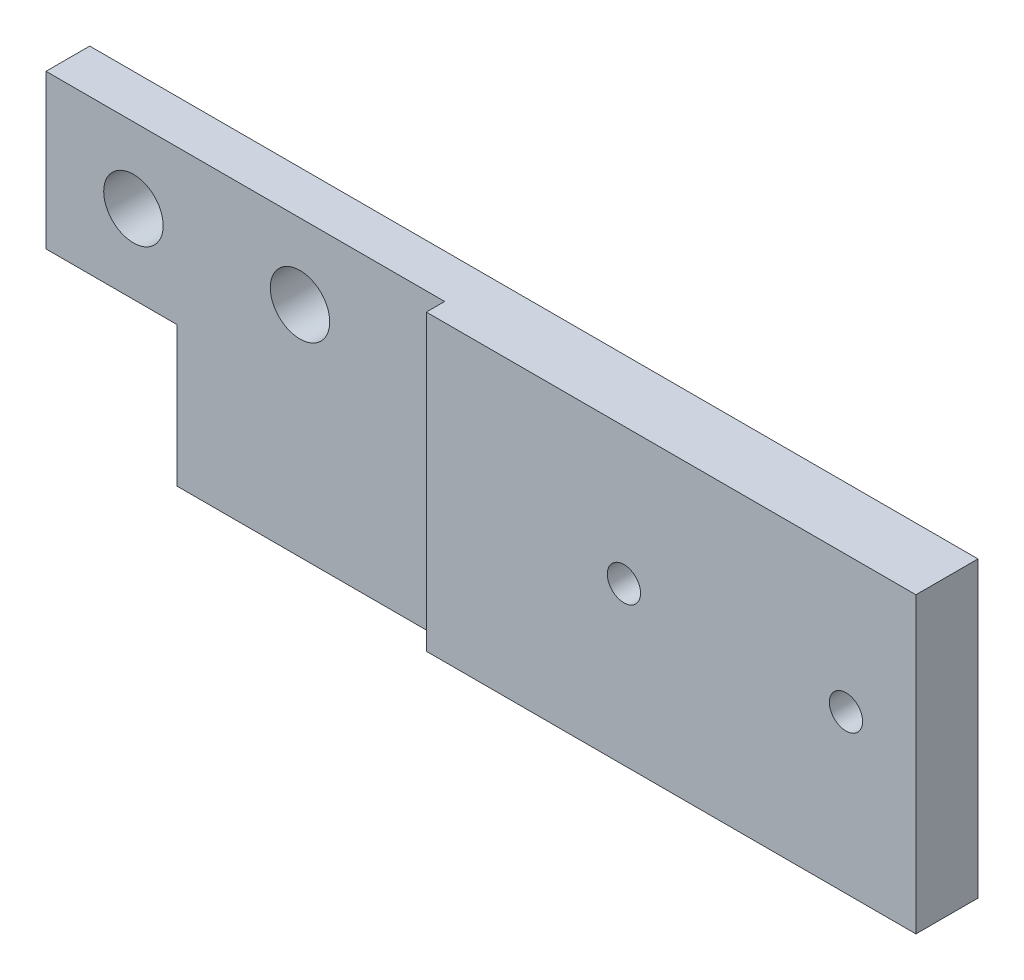
ISO-10303-21;
HEADER;
FILE_DESCRIPTION(('STEP AP214'),'2;1');
FILE_NAME('part.step','',(''),(''),'','','');
FILE_SCHEMA(('AUTOMOTIVE_DESIGN { 1 0 10303 214 1 1 1 1 }'));
ENDSEC;
DATA;
#1=APPLICATION_CONTEXT('core data for automotive mechanical design processes');
#2=APPLICATION_PROTOCOL_DEFINITION('international standard','automotive_design',2000,#1);
#3=PRODUCT_CONTEXT('',#1,'mechanical');
#4=PRODUCT('Part','Part','',(#3));
#5=PRODUCT_RELATED_PRODUCT_CATEGORY('part','',(#4));
#6=PRODUCT_DEFINITION_FORMATION('','',#4);
#7=PRODUCT_DEFINITION_CONTEXT('part definition',#1,'design');
#8=PRODUCT_DEFINITION('design','',#6,#7);
#9=PRODUCT_DEFINITION_SHAPE('','',#8);
#10=(LENGTH_UNIT() NAMED_UNIT(*) SI_UNIT(.MILLI.,.METRE.));
#11=(NAMED_UNIT(*) PLANE_ANGLE_UNIT() SI_UNIT($,.RADIAN.));
#12=(NAMED_UNIT(*) SI_UNIT($,.STERADIAN.) SOLID_ANGLE_UNIT());
#13=UNCERTAINTY_MEASURE_WITH_UNIT(LENGTH_MEASURE(1.E-05),#10,'distance_accuracy_value','');
#14=(GEOMETRIC_REPRESENTATION_CONTEXT(3) GLOBAL_UNCERTAINTY_ASSIGNED_CONTEXT((#13)) GLOBAL_UNIT_ASSIGNED_CONTEXT((#10,
#11,#12)) REPRESENTATION_CONTEXT('',''));
#15=CARTESIAN_POINT('',(0.,0.,0.));
#16=DIRECTION('',(0.,0.,1.));
#17=DIRECTION('',(1.,0.,0.));
#18=AXIS2_PLACEMENT_3D('',#15,#16,#17);
#19=CARTESIAN_POINT('',(0.,0.,5.));
#20=DIRECTION('',(0.,0.,1.));
#21=DIRECTION('',(1.,0.,0.));
#22=AXIS2_PLACEMENT_3D('',#19,#20,#21);
#23=PLANE('',#22);
#24=CARTESIAN_POINT('',(-21.75,8.20043999999998,5.));
#25=DIRECTION('',(0.,0.,1.));
#26=DIRECTION('',(1.,0.,0.));
#27=AXIS2_PLACEMENT_3D('',#24,#25,#26);
#28=CIRCLE('',#27,3.4);
#29=CARTESIAN_POINT('',(-25.15,8.20043999999998,5.));
#30=VERTEX_POINT('',#29);
#31=EDGE_CURVE('E155',#30,#30,#28,.F.);
#32=ORIENTED_EDGE('',*,*,#31,.T.);
#33=EDGE_LOOP('',(#32));
#34=FACE_BOUND('',#33,.T.);
#35=CARTESIAN_POINT('',(-40.8,8.20043999999999,5.));
#36=DIRECTION('',(0.,0.,1.));
#37=DIRECTION('',(1.,0.,0.));
#38=AXIS2_PLACEMENT_3D('',#35,#36,#37);
#39=CIRCLE('',#38,3.4);
#40=CARTESIAN_POINT('',(-44.2,8.20043999999999,5.));
#41=VERTEX_POINT('',#40);
#42=EDGE_CURVE('E154',#41,#41,#39,.F.);
#43=ORIENTED_EDGE('',*,*,#42,.T.);
#44=EDGE_LOOP('',(#43));
#45=FACE_BOUND('',#44,.T.);
#46=DIRECTION('',(1.,0.,0.));
#47=VECTOR('',#46,1.);
#48=CARTESIAN_POINT('',(50.8,-16.79956,5.));
#49=LINE('',#48,#47);
#50=CARTESIAN_POINT('',(-35.8,-16.79956,5.));
#51=VERTEX_POINT('',#50);
#52=CARTESIAN_POINT('',(-5.19999999999999,-16.79956,5.));
#53=VERTEX_POINT('',#52);
#54=EDGE_CURVE('E172',#51,#53,#49,.T.);
#55=ORIENTED_EDGE('',*,*,#54,.T.);
#56=DIRECTION('',(0.,1.,0.));
#57=VECTOR('',#56,1.);
#58=CARTESIAN_POINT('',(-5.19999999999999,0.,5.));
#59=LINE('',#58,#57);
#60=CARTESIAN_POINT('',(-5.19999999999999,16.79956,5.));
#61=VERTEX_POINT('',#60);
#62=EDGE_CURVE('E105',#53,#61,#59,.T.);
#63=ORIENTED_EDGE('',*,*,#62,.T.);
#64=DIRECTION('',(-1.,0.,0.));
#65=VECTOR('',#64,1.);
#66=CARTESIAN_POINT('',(50.8,16.79956,5.));
#67=LINE('',#66,#65);
#68=CARTESIAN_POINT('',(-50.8,16.79956,5.));
#69=VERTEX_POINT('',#68);
#70=EDGE_CURVE('E175',#61,#69,#67,.T.);
#71=ORIENTED_EDGE('',*,*,#70,.T.);
#72=DIRECTION('',(0.,-1.,0.));
#73=VECTOR('',#72,1.);
#74=CARTESIAN_POINT('',(-50.8,-16.79956,5.));
#75=LINE('',#74,#73);
#76=CARTESIAN_POINT('',(-50.8,-0.799560000000012,5.));
#77=VERTEX_POINT('',#76);
#78=EDGE_CURVE('E169',#69,#77,#75,.T.);
#79=ORIENTED_EDGE('',*,*,#78,.T.);
#80=DIRECTION('',(1.,0.,0.));
#81=VECTOR('',#80,1.);
#82=CARTESIAN_POINT('',(-50.8,-0.799560000000012,5.));
#83=LINE('',#82,#81);
#84=CARTESIAN_POINT('',(-35.8,-0.799560000000015,5.));
#85=VERTEX_POINT('',#84);
#86=EDGE_CURVE('E138',#77,#85,#83,.T.);
#87=ORIENTED_EDGE('',*,*,#86,.T.);
#88=DIRECTION('',(0.,1.,0.));
#89=VECTOR('',#88,1.);
#90=CARTESIAN_POINT('',(-35.8,-16.79956,5.));
#91=LINE('',#90,#89);
#92=EDGE_CURVE('E136',#51,#85,#91,.T.);
#93=ORIENTED_EDGE('',*,*,#92,.F.);
#94=EDGE_LOOP('',(#55,#63,#71,#79,#87,#93));
#95=FACE_BOUND('',#94,.T.);
#96=ADVANCED_FACE('F35',(#34,#45,#95),#23,.T.);
#97=CARTESIAN_POINT('',(50.8,-16.79956,5.));
#98=DIRECTION('',(0.,1.,0.));
#99=DIRECTION('',(-1.,0.,0.));
#100=AXIS2_PLACEMENT_3D('',#97,#98,#99);
#101=PLANE('',#100);
#102=DIRECTION('',(0.,0.,-1.));
#103=VECTOR('',#102,1.);
#104=CARTESIAN_POINT('',(-35.8,-16.79956,5.));
#105=LINE('',#104,#103);
#106=CARTESIAN_POINT('',(-35.8,-16.79956,0.));
#107=VERTEX_POINT('',#106);
#108=EDGE_CURVE('E148',#51,#107,#105,.T.);
#109=ORIENTED_EDGE('',*,*,#108,.T.);
#110=DIRECTION('',(1.,0.,0.));
#111=VECTOR('',#110,1.);
#112=CARTESIAN_POINT('',(50.8,-16.79956,0.));
#113=LINE('',#112,#111);
#114=CARTESIAN_POINT('',(50.8,-16.79956,0.));
#115=VERTEX_POINT('',#114);
#116=EDGE_CURVE('E180',#107,#115,#113,.T.);
#117=ORIENTED_EDGE('',*,*,#116,.T.);
#118=DIRECTION('',(0.,0.,-1.));
#119=VECTOR('',#118,1.);
#120=CARTESIAN_POINT('',(50.8,-16.79956,5.));
#121=LINE('',#120,#119);
#122=CARTESIAN_POINT('',(50.8,-16.79956,7.1));
#123=VERTEX_POINT('',#122);
#124=EDGE_CURVE('E11',#123,#115,#121,.T.);
#125=ORIENTED_EDGE('',*,*,#124,.F.);
#126=DIRECTION('',(1.,0.,0.));
#127=VECTOR('',#126,1.);
#128=CARTESIAN_POINT('',(0.,-16.79956,7.1));
#129=LINE('',#128,#127);
#130=CARTESIAN_POINT('',(-5.19999999999999,-16.79956,7.1));
#131=VERTEX_POINT('',#130);
#132=EDGE_CURVE('E112',#131,#123,#129,.T.);
#133=ORIENTED_EDGE('',*,*,#132,.F.);
#134=DIRECTION('',(0.,0.,-1.));
#135=VECTOR('',#134,1.);
#136=CARTESIAN_POINT('',(-5.19999999999999,-16.79956,7.1));
#137=LINE('',#136,#135);
#138=EDGE_CURVE('E100',#131,#53,#137,.T.);
#139=ORIENTED_EDGE('',*,*,#138,.T.);
#140=ORIENTED_EDGE('',*,*,#54,.F.);
#141=EDGE_LOOP('',(#109,#117,#125,#133,#139,#140));
#142=FACE_BOUND('',#141,.T.);
#143=ADVANCED_FACE('F114',(#142),#101,.F.);
#144=CARTESIAN_POINT('',(0.,0.,0.));
#145=DIRECTION('',(0.,0.,1.));
#146=DIRECTION('',(1.,0.,0.));
#147=AXIS2_PLACEMENT_3D('',#144,#145,#146);
#148=PLANE('',#147);
#149=CARTESIAN_POINT('',(-21.75,8.20043999999998,0.));
#150=DIRECTION('',(0.,0.,-1.));
#151=DIRECTION('',(-1.,0.,0.));
#152=AXIS2_PLACEMENT_3D('',#149,#150,#151);
#153=CIRCLE('',#152,3.4);
#154=CARTESIAN_POINT('',(-25.15,8.20043999999998,0.));
#155=VERTEX_POINT('',#154);
#156=EDGE_CURVE('E162',#155,#155,#153,.T.);
#157=ORIENTED_EDGE('',*,*,#156,.F.);
#158=EDGE_LOOP('',(#157));
#159=FACE_BOUND('',#158,.T.);
#160=CARTESIAN_POINT('',(42.8,1.20043999999999,0.));
#161=DIRECTION('',(0.,0.,-1.));
#162=DIRECTION('',(-1.,0.,0.));
#163=AXIS2_PLACEMENT_3D('',#160,#161,#162);
#164=CIRCLE('',#163,1.9);
#165=CARTESIAN_POINT('',(40.9,1.20043999999999,0.));
#166=VERTEX_POINT('',#165);
#167=EDGE_CURVE('E161',#166,#166,#164,.T.);
#168=ORIENTED_EDGE('',*,*,#167,.F.);
#169=EDGE_LOOP('',(#168));
#170=FACE_BOUND('',#169,.T.);
#171=CARTESIAN_POINT('',(17.4,1.20043999999999,0.));
#172=DIRECTION('',(0.,0.,-1.));
#173=DIRECTION('',(-1.,0.,0.));
#174=AXIS2_PLACEMENT_3D('',#171,#172,#173);
#175=CIRCLE('',#174,1.9);
#176=CARTESIAN_POINT('',(15.5,1.20043999999999,0.));
#177=VERTEX_POINT('',#176);
#178=EDGE_CURVE('E150',#177,#177,#175,.T.);
#179=ORIENTED_EDGE('',*,*,#178,.F.);
#180=EDGE_LOOP('',(#179));
#181=FACE_BOUND('',#180,.T.);
#182=CARTESIAN_POINT('',(-40.8,8.20043999999999,0.));
#183=DIRECTION('',(0.,0.,-1.));
#184=DIRECTION('',(-1.,0.,0.));
#185=AXIS2_PLACEMENT_3D('',#182,#183,#184);
#186=CIRCLE('',#185,3.4);
#187=CARTESIAN_POINT('',(-44.2,8.20043999999999,0.));
#188=VERTEX_POINT('',#187);
#189=EDGE_CURVE('E151',#188,#188,#186,.T.);
#190=ORIENTED_EDGE('',*,*,#189,.F.);
#191=EDGE_LOOP('',(#190));
#192=FACE_BOUND('',#191,.T.);
#193=DIRECTION('',(0.,1.,0.));
#194=VECTOR('',#193,1.);
#195=CARTESIAN_POINT('',(-35.8,-16.79956,0.));
#196=LINE('',#195,#194);
#197=CARTESIAN_POINT('',(-35.8,-0.799560000000015,0.));
#198=VERTEX_POINT('',#197);
#199=EDGE_CURVE('E109',#107,#198,#196,.T.);
#200=ORIENTED_EDGE('',*,*,#199,.T.);
#201=DIRECTION('',(1.,0.,0.));
#202=VECTOR('',#201,1.);
#203=CARTESIAN_POINT('',(-50.8,-0.799560000000012,0.));
#204=LINE('',#203,#202);
#205=CARTESIAN_POINT('',(-50.8,-0.799560000000012,0.));
#206=VERTEX_POINT('',#205);
#207=EDGE_CURVE('E139',#206,#198,#204,.T.);
#208=ORIENTED_EDGE('',*,*,#207,.F.);
#209=DIRECTION('',(0.,-1.,0.));
#210=VECTOR('',#209,1.);
#211=CARTESIAN_POINT('',(-50.8,-16.79956,0.));
#212=LINE('',#211,#210);
#213=CARTESIAN_POINT('',(-50.8,16.79956,0.));
#214=VERTEX_POINT('',#213);
#215=EDGE_CURVE('E158',#214,#206,#212,.T.);
#216=ORIENTED_EDGE('',*,*,#215,.F.);
#217=DIRECTION('',(-1.,0.,0.));
#218=VECTOR('',#217,1.);
#219=CARTESIAN_POINT('',(50.8,16.79956,0.));
#220=LINE('',#219,#218);
#221=CARTESIAN_POINT('',(50.8,16.79956,0.));
#222=VERTEX_POINT('',#221);
#223=EDGE_CURVE('E173',#222,#214,#220,.T.);
#224=ORIENTED_EDGE('',*,*,#223,.F.);
#225=DIRECTION('',(0.,1.,0.));
#226=VECTOR('',#225,1.);
#227=CARTESIAN_POINT('',(50.8,-16.79956,0.));
#228=LINE('',#227,#226);
#229=EDGE_CURVE('E182',#115,#222,#228,.T.);
#230=ORIENTED_EDGE('',*,*,#229,.F.);
#231=ORIENTED_EDGE('',*,*,#116,.F.);
#232=EDGE_LOOP('',(#200,#208,#216,#224,#230,#231));
#233=FACE_BOUND('',#232,.T.);
#234=ADVANCED_FACE('F195',(#159,#170,#181,#192,#233),#148,.F.);
#235=CARTESIAN_POINT('',(-50.8,-16.79956,5.));
#236=DIRECTION('',(1.,0.,0.));
#237=DIRECTION('',(0.,0.,-1.));
#238=AXIS2_PLACEMENT_3D('',#235,#236,#237);
#239=PLANE('',#238);
#240=ORIENTED_EDGE('',*,*,#215,.T.);
#241=DIRECTION('',(0.,0.,-1.));
#242=VECTOR('',#241,1.);
#243=CARTESIAN_POINT('',(-50.8,-0.799560000000012,5.));
#244=LINE('',#243,#242);
#245=EDGE_CURVE('E58',#77,#206,#244,.T.);
#246=ORIENTED_EDGE('',*,*,#245,.F.);
#247=ORIENTED_EDGE('',*,*,#78,.F.);
#248=DIRECTION('',(0.,0.,-1.));
#249=VECTOR('',#248,1.);
#250=CARTESIAN_POINT('',(-50.8,16.79956,5.));
#251=LINE('',#250,#249);
#252=EDGE_CURVE('E177',#69,#214,#251,.T.);
#253=ORIENTED_EDGE('',*,*,#252,.T.);
#254=EDGE_LOOP('',(#240,#246,#247,#253));
#255=FACE_BOUND('',#254,.T.);
#256=ADVANCED_FACE('F37',(#255),#239,.F.);
#257=CARTESIAN_POINT('',(50.8,-16.79956,5.));
#258=DIRECTION('',(-1.,0.,0.));
#259=DIRECTION('',(0.,0.,1.));
#260=AXIS2_PLACEMENT_3D('',#257,#258,#259);
#261=PLANE('',#260);
#262=ORIENTED_EDGE('',*,*,#229,.T.);
#263=DIRECTION('',(0.,0.,-1.));
#264=VECTOR('',#263,1.);
#265=CARTESIAN_POINT('',(50.8,16.79956,5.));
#266=LINE('',#265,#264);
#267=CARTESIAN_POINT('',(50.8,16.79956,7.1));
#268=VERTEX_POINT('',#267);
#269=EDGE_CURVE('E43',#268,#222,#266,.T.);
#270=ORIENTED_EDGE('',*,*,#269,.F.);
#271=DIRECTION('',(0.,1.,0.));
#272=VECTOR('',#271,1.);
#273=CARTESIAN_POINT('',(50.8,0.,7.1));
#274=LINE('',#273,#272);
#275=EDGE_CURVE('E118',#123,#268,#274,.T.);
#276=ORIENTED_EDGE('',*,*,#275,.F.);
#277=ORIENTED_EDGE('',*,*,#124,.T.);
#278=EDGE_LOOP('',(#262,#270,#276,#277));
#279=FACE_BOUND('',#278,.T.);
#280=ADVANCED_FACE('F232',(#279),#261,.F.);
#281=CARTESIAN_POINT('',(50.8,16.79956,5.));
#282=DIRECTION('',(0.,-1.,0.));
#283=DIRECTION('',(1.,0.,0.));
#284=AXIS2_PLACEMENT_3D('',#281,#282,#283);
#285=PLANE('',#284);
#286=ORIENTED_EDGE('',*,*,#223,.T.);
#287=ORIENTED_EDGE('',*,*,#252,.F.);
#288=ORIENTED_EDGE('',*,*,#70,.F.);
#289=DIRECTION('',(0.,0.,-1.));
#290=VECTOR('',#289,1.);
#291=CARTESIAN_POINT('',(-5.19999999999999,16.79956,7.1));
#292=LINE('',#291,#290);
#293=CARTESIAN_POINT('',(-5.19999999999999,16.79956,7.1));
#294=VERTEX_POINT('',#293);
#295=EDGE_CURVE('E50',#294,#61,#292,.T.);
#296=ORIENTED_EDGE('',*,*,#295,.F.);
#297=DIRECTION('',(-1.,0.,0.));
#298=VECTOR('',#297,1.);
#299=CARTESIAN_POINT('',(0.,16.79956,7.1));
#300=LINE('',#299,#298);
#301=EDGE_CURVE('E123',#268,#294,#300,.T.);
#302=ORIENTED_EDGE('',*,*,#301,.F.);
#303=ORIENTED_EDGE('',*,*,#269,.T.);
#304=EDGE_LOOP('',(#286,#287,#288,#296,#302,#303));
#305=FACE_BOUND('',#304,.T.);
#306=ADVANCED_FACE('F189',(#305),#285,.F.);
#307=CARTESIAN_POINT('',(-21.75,8.20043999999998,14.616652224137));
#308=DIRECTION('',(0.,0.,-1.));
#309=DIRECTION('',(-1.,0.,0.));
#310=AXIS2_PLACEMENT_3D('',#307,#308,#309);
#311=CYLINDRICAL_SURFACE('',#310,3.4);
#312=CARTESIAN_POINT('',(-25.15,8.20043999999998,0.));
#313=CARTESIAN_POINT('',(-25.15,8.20043999999998,0.0520833333333351));
#314=CARTESIAN_POINT('',(-25.15,8.20043999999998,0.104166666666669));
#315=CARTESIAN_POINT('',(-25.15,8.20043999999998,0.208333333333335));
#316=CARTESIAN_POINT('',(-25.15,8.20043999999998,0.260416666666669));
#317=CARTESIAN_POINT('',(-25.15,8.20043999999998,0.364583333333335));
#318=CARTESIAN_POINT('',(-25.15,8.20043999999998,0.416666666666669));
#319=CARTESIAN_POINT('',(-25.15,8.20043999999998,0.520833333333335));
#320=CARTESIAN_POINT('',(-25.15,8.20043999999998,0.572916666666669));
#321=CARTESIAN_POINT('',(-25.15,8.20043999999998,0.677083333333335));
#322=CARTESIAN_POINT('',(-25.15,8.20043999999998,0.729166666666668));
#323=CARTESIAN_POINT('',(-25.15,8.20043999999998,0.833333333333334));
#324=CARTESIAN_POINT('',(-25.15,8.20043999999998,0.885416666666668));
#325=CARTESIAN_POINT('',(-25.15,8.20043999999998,0.989583333333334));
#326=CARTESIAN_POINT('',(-25.15,8.20043999999998,1.04166666666667));
#327=CARTESIAN_POINT('',(-25.15,8.20043999999998,1.14583333333333));
#328=CARTESIAN_POINT('',(-25.15,8.20043999999998,1.19791666666667));
#329=CARTESIAN_POINT('',(-25.15,8.20043999999998,1.30208333333333));
#330=CARTESIAN_POINT('',(-25.15,8.20043999999998,1.35416666666667));
#331=CARTESIAN_POINT('',(-25.15,8.20043999999998,1.45833333333333));
#332=CARTESIAN_POINT('',(-25.15,8.20043999999998,1.51041666666667));
#333=CARTESIAN_POINT('',(-25.15,8.20043999999998,1.61458333333333));
#334=CARTESIAN_POINT('',(-25.15,8.20043999999998,1.66666666666667));
#335=CARTESIAN_POINT('',(-25.15,8.20043999999998,1.77083333333333));
#336=CARTESIAN_POINT('',(-25.15,8.20043999999998,1.82291666666667));
#337=CARTESIAN_POINT('',(-25.15,8.20043999999998,1.92708333333333));
#338=CARTESIAN_POINT('',(-25.15,8.20043999999998,1.97916666666667));
#339=CARTESIAN_POINT('',(-25.15,8.20043999999998,2.08333333333333));
#340=CARTESIAN_POINT('',(-25.15,8.20043999999998,2.13541666666667));
#341=CARTESIAN_POINT('',(-25.15,8.20043999999998,2.23958333333333));
#342=CARTESIAN_POINT('',(-25.15,8.20043999999998,2.29166666666667));
#343=CARTESIAN_POINT('',(-25.15,8.20043999999998,2.39583333333333));
#344=CARTESIAN_POINT('',(-25.15,8.20043999999998,2.44791666666667));
#345=CARTESIAN_POINT('',(-25.15,8.20043999999998,2.55208333333333));
#346=CARTESIAN_POINT('',(-25.15,8.20043999999998,2.60416666666667));
#347=CARTESIAN_POINT('',(-25.15,8.20043999999998,2.70833333333333));
#348=CARTESIAN_POINT('',(-25.15,8.20043999999998,2.76041666666667));
#349=CARTESIAN_POINT('',(-25.15,8.20043999999998,2.86458333333333));
#350=CARTESIAN_POINT('',(-25.15,8.20043999999998,2.91666666666667));
#351=CARTESIAN_POINT('',(-25.15,8.20043999999998,3.02083333333333));
#352=CARTESIAN_POINT('',(-25.15,8.20043999999998,3.07291666666667));
#353=CARTESIAN_POINT('',(-25.15,8.20043999999998,3.17708333333333));
#354=CARTESIAN_POINT('',(-25.15,8.20043999999998,3.22916666666667));
#355=CARTESIAN_POINT('',(-25.15,8.20043999999998,3.33333333333333));
#356=CARTESIAN_POINT('',(-25.15,8.20043999999998,3.38541666666667));
#357=CARTESIAN_POINT('',(-25.15,8.20043999999998,3.48958333333333));
#358=CARTESIAN_POINT('',(-25.15,8.20043999999998,3.54166666666667));
#359=CARTESIAN_POINT('',(-25.15,8.20043999999998,3.64583333333333));
#360=CARTESIAN_POINT('',(-25.15,8.20043999999998,3.69791666666667));
#361=CARTESIAN_POINT('',(-25.15,8.20043999999998,3.80208333333333));
#362=CARTESIAN_POINT('',(-25.15,8.20043999999998,3.85416666666667));
#363=CARTESIAN_POINT('',(-25.15,8.20043999999998,3.95833333333333));
#364=CARTESIAN_POINT('',(-25.15,8.20043999999998,4.01041666666667));
#365=CARTESIAN_POINT('',(-25.15,8.20043999999998,4.11458333333333));
#366=CARTESIAN_POINT('',(-25.15,8.20043999999998,4.16666666666667));
#367=CARTESIAN_POINT('',(-25.15,8.20043999999998,4.27083333333333));
#368=CARTESIAN_POINT('',(-25.15,8.20043999999998,4.32291666666667));
#369=CARTESIAN_POINT('',(-25.15,8.20043999999998,4.42708333333333));
#370=CARTESIAN_POINT('',(-25.15,8.20043999999998,4.47916666666667));
#371=CARTESIAN_POINT('',(-25.15,8.20043999999998,4.58333333333333));
#372=CARTESIAN_POINT('',(-25.15,8.20043999999998,4.63541666666667));
#373=CARTESIAN_POINT('',(-25.15,8.20043999999998,4.73958333333333));
#374=CARTESIAN_POINT('',(-25.15,8.20043999999998,4.79166666666667));
#375=CARTESIAN_POINT('',(-25.15,8.20043999999998,4.89583333333333));
#376=CARTESIAN_POINT('',(-25.15,8.20043999999998,4.94791666666667));
#377=CARTESIAN_POINT('',(-25.15,8.20043999999998,5.));
#378=B_SPLINE_CURVE_WITH_KNOTS('',3,(#312,#313,#314,#315,#316,#317,#318,#319,#320,#321,#322,
#323,#324,#325,#326,#327,#328,#329,#330,#331,#332,#333,#334,#335,#336,#337,#338,#339,#340,#341,
#342,#343,#344,#345,#346,#347,#348,#349,#350,#351,#352,#353,#354,#355,#356,#357,#358,#359,#360,
#361,#362,#363,#364,#365,#366,#367,#368,#369,#370,#371,#372,#373,#374,#375,#376,#377),
.UNSPECIFIED.,.F.,.F.,(4,2,2,2,2,2,2,2,2,2,2,2,2,2,2,2,2,2,2,2,2,2,2,2,2,2,2,2,2,2,2,2,4),(0.,
0.15625,0.3125,0.46875,0.625000000000001,0.781249999999999,0.937499999999999,1.09375,1.25,
1.40625,1.5625,1.71875,1.875,2.03125,2.1875,2.34375,2.5,2.65625,2.8125,2.96875,3.125,3.28125,
3.4375,3.59375,3.75,3.90625,4.0625,4.21875,4.375,4.53125,4.6875,4.84375,5.),.UNSPECIFIED.);
#379=EDGE_CURVE('BSEAM231',#155,#30,#378,.T.);
#380=ORIENTED_EDGE('',*,*,#156,.T.);
#381=ORIENTED_EDGE('',*,*,#31,.F.);
#382=ORIENTED_EDGE('',*,*,#379,.T.);
#383=ORIENTED_EDGE('',*,*,#379,.F.);
#384=EDGE_LOOP('',(#380,#382,#381,#383));
#385=FACE_BOUND('',#384,.T.);
#386=ADVANCED_FACE('F231',(#385),#311,.F.);
#387=CARTESIAN_POINT('',(42.8,1.20043999999999,14.616652224137));
#388=DIRECTION('',(0.,0.,-1.));
#389=DIRECTION('',(-1.,0.,0.));
#390=AXIS2_PLACEMENT_3D('',#387,#388,#389);
#391=CYLINDRICAL_SURFACE('',#390,1.9);
#392=CARTESIAN_POINT('',(42.8,1.20043999999999,7.1));
#393=DIRECTION('',(0.,0.,1.));
#394=DIRECTION('',(1.,0.,0.));
#395=AXIS2_PLACEMENT_3D('',#392,#393,#394);
#396=CIRCLE('',#395,1.9);
#397=CARTESIAN_POINT('',(40.9,1.20043999999999,7.1));
#398=VERTEX_POINT('',#397);
#399=EDGE_CURVE('E132',#398,#398,#396,.F.);
#400=CARTESIAN_POINT('',(40.9,1.20043999999999,0.));
#401=CARTESIAN_POINT('',(40.9,1.20043999999999,0.073958333333335));
#402=CARTESIAN_POINT('',(40.9,1.20043999999999,0.147916666666668));
#403=CARTESIAN_POINT('',(40.9,1.20043999999999,0.295833333333335));
#404=CARTESIAN_POINT('',(40.9,1.20043999999999,0.369791666666668));
#405=CARTESIAN_POINT('',(40.9,1.20043999999999,0.517708333333335));
#406=CARTESIAN_POINT('',(40.9,1.20043999999999,0.591666666666668));
#407=CARTESIAN_POINT('',(40.9,1.20043999999999,0.739583333333335));
#408=CARTESIAN_POINT('',(40.9,1.20043999999999,0.813541666666668));
#409=CARTESIAN_POINT('',(40.9,1.20043999999999,0.961458333333334));
#410=CARTESIAN_POINT('',(40.9,1.20043999999999,1.03541666666667));
#411=CARTESIAN_POINT('',(40.9,1.20043999999999,1.18333333333333));
#412=CARTESIAN_POINT('',(40.9,1.20043999999999,1.25729166666667));
#413=CARTESIAN_POINT('',(40.9,1.20043999999999,1.40520833333333));
#414=CARTESIAN_POINT('',(40.9,1.20043999999999,1.47916666666667));
#415=CARTESIAN_POINT('',(40.9,1.20043999999999,1.62708333333333));
#416=CARTESIAN_POINT('',(40.9,1.20043999999999,1.70104166666667));
#417=CARTESIAN_POINT('',(40.9,1.20043999999999,1.84895833333333));
#418=CARTESIAN_POINT('',(40.9,1.20043999999999,1.92291666666667));
#419=CARTESIAN_POINT('',(40.9,1.20043999999999,2.07083333333333));
#420=CARTESIAN_POINT('',(40.9,1.20043999999999,2.14479166666667));
#421=CARTESIAN_POINT('',(40.9,1.20043999999999,2.29270833333333));
#422=CARTESIAN_POINT('',(40.9,1.20043999999999,2.36666666666667));
#423=CARTESIAN_POINT('',(40.9,1.20043999999999,2.51458333333334));
#424=CARTESIAN_POINT('',(40.9,1.20043999999999,2.58854166666667));
#425=CARTESIAN_POINT('',(40.9,1.20043999999999,2.73645833333333));
#426=CARTESIAN_POINT('',(40.9,1.20043999999999,2.81041666666667));
#427=CARTESIAN_POINT('',(40.9,1.20043999999999,2.95833333333333));
#428=CARTESIAN_POINT('',(40.9,1.20043999999999,3.03229166666667));
#429=CARTESIAN_POINT('',(40.9,1.20043999999999,3.18020833333333));
#430=CARTESIAN_POINT('',(40.9,1.20043999999999,3.25416666666667));
#431=CARTESIAN_POINT('',(40.9,1.20043999999999,3.40208333333333));
#432=CARTESIAN_POINT('',(40.9,1.20043999999999,3.47604166666667));
#433=CARTESIAN_POINT('',(40.9,1.20043999999999,3.62395833333333));
#434=CARTESIAN_POINT('',(40.9,1.20043999999999,3.69791666666667));
#435=CARTESIAN_POINT('',(40.9,1.20043999999999,3.84583333333333));
#436=CARTESIAN_POINT('',(40.9,1.20043999999999,3.91979166666667));
#437=CARTESIAN_POINT('',(40.9,1.20043999999999,4.06770833333333));
#438=CARTESIAN_POINT('',(40.9,1.20043999999999,4.14166666666667));
#439=CARTESIAN_POINT('',(40.9,1.20043999999999,4.28958333333333));
#440=CARTESIAN_POINT('',(40.9,1.20043999999999,4.36354166666667));
#441=CARTESIAN_POINT('',(40.9,1.20043999999999,4.51145833333333));
#442=CARTESIAN_POINT('',(40.9,1.20043999999999,4.58541666666667));
#443=CARTESIAN_POINT('',(40.9,1.20043999999999,4.73333333333334));
#444=CARTESIAN_POINT('',(40.9,1.20043999999999,4.80729166666667));
#445=CARTESIAN_POINT('',(40.9,1.20043999999999,4.95520833333333));
#446=CARTESIAN_POINT('',(40.9,1.20043999999999,5.02916666666667));
#447=CARTESIAN_POINT('',(40.9,1.20043999999999,5.17708333333333));
#448=CARTESIAN_POINT('',(40.9,1.20043999999999,5.25104166666667));
#449=CARTESIAN_POINT('',(40.9,1.20043999999999,5.39895833333333));
#450=CARTESIAN_POINT('',(40.9,1.20043999999999,5.47291666666667));
#451=CARTESIAN_POINT('',(40.9,1.20043999999999,5.62083333333333));
#452=CARTESIAN_POINT('',(40.9,1.20043999999999,5.69479166666667));
#453=CARTESIAN_POINT('',(40.9,1.20043999999999,5.84270833333333));
#454=CARTESIAN_POINT('',(40.9,1.20043999999999,5.91666666666667));
#455=CARTESIAN_POINT('',(40.9,1.20043999999999,6.06458333333333));
#456=CARTESIAN_POINT('',(40.9,1.20043999999999,6.13854166666667));
#457=CARTESIAN_POINT('',(40.9,1.20043999999999,6.28645833333333));
#458=CARTESIAN_POINT('',(40.9,1.20043999999999,6.36041666666667));
#459=CARTESIAN_POINT('',(40.9,1.20043999999999,6.50833333333333));
#460=CARTESIAN_POINT('',(40.9,1.20043999999999,6.58229166666667));
#461=CARTESIAN_POINT('',(40.9,1.20043999999999,6.73020833333333));
#462=CARTESIAN_POINT('',(40.9,1.20043999999999,6.80416666666667));
#463=CARTESIAN_POINT('',(40.9,1.20043999999999,6.95208333333333));
#464=CARTESIAN_POINT('',(40.9,1.20043999999999,7.02604166666667));
#465=CARTESIAN_POINT('',(40.9,1.20043999999999,7.1));
#466=B_SPLINE_CURVE_WITH_KNOTS('',3,(#400,#401,#402,#403,#404,#405,#406,#407,#408,#409,#410,
#411,#412,#413,#414,#415,#416,#417,#418,#419,#420,#421,#422,#423,#424,#425,#426,#427,#428,#429,
#430,#431,#432,#433,#434,#435,#436,#437,#438,#439,#440,#441,#442,#443,#444,#445,#446,#447,#448,
#449,#450,#451,#452,#453,#454,#455,#456,#457,#458,#459,#460,#461,#462,#463,#464,#465),
.UNSPECIFIED.,.F.,.F.,(4,2,2,2,2,2,2,2,2,2,2,2,2,2,2,2,2,2,2,2,2,2,2,2,2,2,2,2,2,2,2,2,4),(0.,
0.221875,0.44375,0.665625,0.887499999999999,1.109375,1.33125,1.553125,1.775,1.996875,2.21875,
2.440625,2.6625,2.884375,3.10625,3.328125,3.55,3.771875,3.99375,4.215625,4.4375,4.659375,
4.88125,5.103125,5.325,5.546875,5.76875,5.990625,6.2125,6.434375,6.65625,6.878125,7.1),.UNSPECIFIED.);
#467=EDGE_CURVE('BSEAM224',#166,#398,#466,.T.);
#468=ORIENTED_EDGE('',*,*,#167,.T.);
#469=ORIENTED_EDGE('',*,*,#399,.F.);
#470=ORIENTED_EDGE('',*,*,#467,.T.);
#471=ORIENTED_EDGE('',*,*,#467,.F.);
#472=EDGE_LOOP('',(#468,#470,#469,#471));
#473=FACE_BOUND('',#472,.T.);
#474=ADVANCED_FACE('F224',(#473),#391,.F.);
#475=CARTESIAN_POINT('',(17.4,1.20043999999999,14.616652224137));
#476=DIRECTION('',(0.,0.,-1.));
#477=DIRECTION('',(-1.,0.,0.));
#478=AXIS2_PLACEMENT_3D('',#475,#476,#477);
#479=CYLINDRICAL_SURFACE('',#478,1.9);
#480=CARTESIAN_POINT('',(17.4,1.20043999999999,7.1));
#481=DIRECTION('',(0.,0.,1.));
#482=DIRECTION('',(1.,0.,0.));
#483=AXIS2_PLACEMENT_3D('',#480,#481,#482);
#484=CIRCLE('',#483,1.9);
#485=CARTESIAN_POINT('',(15.5,1.20043999999999,7.1));
#486=VERTEX_POINT('',#485);
#487=EDGE_CURVE('E129',#486,#486,#484,.F.);
#488=CARTESIAN_POINT('',(15.5,1.20043999999999,0.));
#489=CARTESIAN_POINT('',(15.5,1.20043999999999,0.073958333333335));
#490=CARTESIAN_POINT('',(15.5,1.20043999999999,0.147916666666668));
#491=CARTESIAN_POINT('',(15.5,1.20043999999999,0.295833333333335));
#492=CARTESIAN_POINT('',(15.5,1.20043999999999,0.369791666666668));
#493=CARTESIAN_POINT('',(15.5,1.20043999999999,0.517708333333335));
#494=CARTESIAN_POINT('',(15.5,1.20043999999999,0.591666666666668));
#495=CARTESIAN_POINT('',(15.5,1.20043999999999,0.739583333333335));
#496=CARTESIAN_POINT('',(15.5,1.20043999999999,0.813541666666668));
#497=CARTESIAN_POINT('',(15.5,1.20043999999999,0.961458333333334));
#498=CARTESIAN_POINT('',(15.5,1.20043999999999,1.03541666666667));
#499=CARTESIAN_POINT('',(15.5,1.20043999999999,1.18333333333333));
#500=CARTESIAN_POINT('',(15.5,1.20043999999999,1.25729166666667));
#501=CARTESIAN_POINT('',(15.5,1.20043999999999,1.40520833333333));
#502=CARTESIAN_POINT('',(15.5,1.20043999999999,1.47916666666667));
#503=CARTESIAN_POINT('',(15.5,1.20043999999999,1.62708333333333));
#504=CARTESIAN_POINT('',(15.5,1.20043999999999,1.70104166666667));
#505=CARTESIAN_POINT('',(15.5,1.20043999999999,1.84895833333333));
#506=CARTESIAN_POINT('',(15.5,1.20043999999999,1.92291666666667));
#507=CARTESIAN_POINT('',(15.5,1.20043999999999,2.07083333333333));
#508=CARTESIAN_POINT('',(15.5,1.20043999999999,2.14479166666667));
#509=CARTESIAN_POINT('',(15.5,1.20043999999999,2.29270833333333));
#510=CARTESIAN_POINT('',(15.5,1.20043999999999,2.36666666666667));
#511=CARTESIAN_POINT('',(15.5,1.20043999999999,2.51458333333334));
#512=CARTESIAN_POINT('',(15.5,1.20043999999999,2.58854166666667));
#513=CARTESIAN_POINT('',(15.5,1.20043999999999,2.73645833333333));
#514=CARTESIAN_POINT('',(15.5,1.20043999999999,2.81041666666667));
#515=CARTESIAN_POINT('',(15.5,1.20043999999999,2.95833333333333));
#516=CARTESIAN_POINT('',(15.5,1.20043999999999,3.03229166666667));
#517=CARTESIAN_POINT('',(15.5,1.20043999999999,3.18020833333333));
#518=CARTESIAN_POINT('',(15.5,1.20043999999999,3.25416666666667));
#519=CARTESIAN_POINT('',(15.5,1.20043999999999,3.40208333333333));
#520=CARTESIAN_POINT('',(15.5,1.20043999999999,3.47604166666667));
#521=CARTESIAN_POINT('',(15.5,1.20043999999999,3.62395833333333));
#522=CARTESIAN_POINT('',(15.5,1.20043999999999,3.69791666666667));
#523=CARTESIAN_POINT('',(15.5,1.20043999999999,3.84583333333333));
#524=CARTESIAN_POINT('',(15.5,1.20043999999999,3.91979166666667));
#525=CARTESIAN_POINT('',(15.5,1.20043999999999,4.06770833333333));
#526=CARTESIAN_POINT('',(15.5,1.20043999999999,4.14166666666667));
#527=CARTESIAN_POINT('',(15.5,1.20043999999999,4.28958333333333));
#528=CARTESIAN_POINT('',(15.5,1.20043999999999,4.36354166666667));
#529=CARTESIAN_POINT('',(15.5,1.20043999999999,4.51145833333333));
#530=CARTESIAN_POINT('',(15.5,1.20043999999999,4.58541666666667));
#531=CARTESIAN_POINT('',(15.5,1.20043999999999,4.73333333333334));
#532=CARTESIAN_POINT('',(15.5,1.20043999999999,4.80729166666667));
#533=CARTESIAN_POINT('',(15.5,1.20043999999999,4.95520833333333));
#534=CARTESIAN_POINT('',(15.5,1.20043999999999,5.02916666666667));
#535=CARTESIAN_POINT('',(15.5,1.20043999999999,5.17708333333333));
#536=CARTESIAN_POINT('',(15.5,1.20043999999999,5.25104166666667));
#537=CARTESIAN_POINT('',(15.5,1.20043999999999,5.39895833333333));
#538=CARTESIAN_POINT('',(15.5,1.20043999999999,5.47291666666667));
#539=CARTESIAN_POINT('',(15.5,1.20043999999999,5.62083333333333));
#540=CARTESIAN_POINT('',(15.5,1.20043999999999,5.69479166666667));
#541=CARTESIAN_POINT('',(15.5,1.20043999999999,5.84270833333333));
#542=CARTESIAN_POINT('',(15.5,1.20043999999999,5.91666666666667));
#543=CARTESIAN_POINT('',(15.5,1.20043999999999,6.06458333333333));
#544=CARTESIAN_POINT('',(15.5,1.20043999999999,6.13854166666667));
#545=CARTESIAN_POINT('',(15.5,1.20043999999999,6.28645833333333));
#546=CARTESIAN_POINT('',(15.5,1.20043999999999,6.36041666666667));
#547=CARTESIAN_POINT('',(15.5,1.20043999999999,6.50833333333333));
#548=CARTESIAN_POINT('',(15.5,1.20043999999999,6.58229166666667));
#549=CARTESIAN_POINT('',(15.5,1.20043999999999,6.73020833333333));
#550=CARTESIAN_POINT('',(15.5,1.20043999999999,6.80416666666667));
#551=CARTESIAN_POINT('',(15.5,1.20043999999999,6.95208333333333));
#552=CARTESIAN_POINT('',(15.5,1.20043999999999,7.02604166666667));
#553=CARTESIAN_POINT('',(15.5,1.20043999999999,7.1));
#554=B_SPLINE_CURVE_WITH_KNOTS('',3,(#488,#489,#490,#491,#492,#493,#494,#495,#496,#497,#498,
#499,#500,#501,#502,#503,#504,#505,#506,#507,#508,#509,#510,#511,#512,#513,#514,#515,#516,#517,
#518,#519,#520,#521,#522,#523,#524,#525,#526,#527,#528,#529,#530,#531,#532,#533,#534,#535,#536,
#537,#538,#539,#540,#541,#542,#543,#544,#545,#546,#547,#548,#549,#550,#551,#552,#553),
.UNSPECIFIED.,.F.,.F.,(4,2,2,2,2,2,2,2,2,2,2,2,2,2,2,2,2,2,2,2,2,2,2,2,2,2,2,2,2,2,2,2,4),(0.,
0.221875,0.44375,0.665625,0.887499999999999,1.109375,1.33125,1.553125,1.775,1.996875,2.21875,
2.440625,2.6625,2.884375,3.10625,3.328125,3.55,3.771875,3.99375,4.215625,4.4375,4.659375,
4.88125,5.103125,5.325,5.546875,5.76875,5.990625,6.2125,6.434375,6.65625,6.878125,7.1),.UNSPECIFIED.);
#555=EDGE_CURVE('BSEAM276',#177,#486,#554,.T.);
#556=ORIENTED_EDGE('',*,*,#178,.T.);
#557=ORIENTED_EDGE('',*,*,#487,.F.);
#558=ORIENTED_EDGE('',*,*,#555,.T.);
#559=ORIENTED_EDGE('',*,*,#555,.F.);
#560=EDGE_LOOP('',(#556,#558,#557,#559));
#561=FACE_BOUND('',#560,.T.);
#562=ADVANCED_FACE('F276',(#561),#479,.F.);
#563=CARTESIAN_POINT('',(-40.8,8.20043999999999,14.616652224137));
#564=DIRECTION('',(0.,0.,-1.));
#565=DIRECTION('',(-1.,0.,0.));
#566=AXIS2_PLACEMENT_3D('',#563,#564,#565);
#567=CYLINDRICAL_SURFACE('',#566,3.4);
#568=CARTESIAN_POINT('',(-44.2,8.20043999999999,0.));
#569=CARTESIAN_POINT('',(-44.2,8.20043999999999,0.0520833333333351));
#570=CARTESIAN_POINT('',(-44.2,8.20043999999999,0.104166666666669));
#571=CARTESIAN_POINT('',(-44.2,8.20043999999999,0.208333333333335));
#572=CARTESIAN_POINT('',(-44.2,8.20043999999999,0.260416666666669));
#573=CARTESIAN_POINT('',(-44.2,8.20043999999999,0.364583333333335));
#574=CARTESIAN_POINT('',(-44.2,8.20043999999999,0.416666666666669));
#575=CARTESIAN_POINT('',(-44.2,8.20043999999999,0.520833333333335));
#576=CARTESIAN_POINT('',(-44.2,8.20043999999999,0.572916666666669));
#577=CARTESIAN_POINT('',(-44.2,8.20043999999999,0.677083333333335));
#578=CARTESIAN_POINT('',(-44.2,8.20043999999999,0.729166666666668));
#579=CARTESIAN_POINT('',(-44.2,8.20043999999999,0.833333333333334));
#580=CARTESIAN_POINT('',(-44.2,8.20043999999999,0.885416666666668));
#581=CARTESIAN_POINT('',(-44.2,8.20043999999999,0.989583333333334));
#582=CARTESIAN_POINT('',(-44.2,8.20043999999999,1.04166666666667));
#583=CARTESIAN_POINT('',(-44.2,8.20043999999999,1.14583333333333));
#584=CARTESIAN_POINT('',(-44.2,8.20043999999999,1.19791666666667));
#585=CARTESIAN_POINT('',(-44.2,8.20043999999999,1.30208333333333));
#586=CARTESIAN_POINT('',(-44.2,8.20043999999999,1.35416666666667));
#587=CARTESIAN_POINT('',(-44.2,8.20043999999999,1.45833333333333));
#588=CARTESIAN_POINT('',(-44.2,8.20043999999999,1.51041666666667));
#589=CARTESIAN_POINT('',(-44.2,8.20043999999999,1.61458333333333));
#590=CARTESIAN_POINT('',(-44.2,8.20043999999999,1.66666666666667));
#591=CARTESIAN_POINT('',(-44.2,8.20043999999999,1.77083333333333));
#592=CARTESIAN_POINT('',(-44.2,8.20043999999999,1.82291666666667));
#593=CARTESIAN_POINT('',(-44.2,8.20043999999999,1.92708333333333));
#594=CARTESIAN_POINT('',(-44.2,8.20043999999999,1.97916666666667));
#595=CARTESIAN_POINT('',(-44.2,8.20043999999999,2.08333333333333));
#596=CARTESIAN_POINT('',(-44.2,8.20043999999999,2.13541666666667));
#597=CARTESIAN_POINT('',(-44.2,8.20043999999999,2.23958333333333));
#598=CARTESIAN_POINT('',(-44.2,8.20043999999999,2.29166666666667));
#599=CARTESIAN_POINT('',(-44.2,8.20043999999999,2.39583333333333));
#600=CARTESIAN_POINT('',(-44.2,8.20043999999999,2.44791666666667));
#601=CARTESIAN_POINT('',(-44.2,8.20043999999999,2.55208333333333));
#602=CARTESIAN_POINT('',(-44.2,8.20043999999999,2.60416666666667));
#603=CARTESIAN_POINT('',(-44.2,8.20043999999999,2.70833333333333));
#604=CARTESIAN_POINT('',(-44.2,8.20043999999999,2.76041666666667));
#605=CARTESIAN_POINT('',(-44.2,8.20043999999999,2.86458333333333));
#606=CARTESIAN_POINT('',(-44.2,8.20043999999999,2.91666666666667));
#607=CARTESIAN_POINT('',(-44.2,8.20043999999999,3.02083333333333));
#608=CARTESIAN_POINT('',(-44.2,8.20043999999999,3.07291666666667));
#609=CARTESIAN_POINT('',(-44.2,8.20043999999999,3.17708333333333));
#610=CARTESIAN_POINT('',(-44.2,8.20043999999999,3.22916666666667));
#611=CARTESIAN_POINT('',(-44.2,8.20043999999999,3.33333333333333));
#612=CARTESIAN_POINT('',(-44.2,8.20043999999999,3.38541666666667));
#613=CARTESIAN_POINT('',(-44.2,8.20043999999999,3.48958333333333));
#614=CARTESIAN_POINT('',(-44.2,8.20043999999999,3.54166666666667));
#615=CARTESIAN_POINT('',(-44.2,8.20043999999999,3.64583333333333));
#616=CARTESIAN_POINT('',(-44.2,8.20043999999999,3.69791666666667));
#617=CARTESIAN_POINT('',(-44.2,8.20043999999999,3.80208333333333));
#618=CARTESIAN_POINT('',(-44.2,8.20043999999999,3.85416666666667));
#619=CARTESIAN_POINT('',(-44.2,8.20043999999999,3.95833333333333));
#620=CARTESIAN_POINT('',(-44.2,8.20043999999999,4.01041666666667));
#621=CARTESIAN_POINT('',(-44.2,8.20043999999999,4.11458333333333));
#622=CARTESIAN_POINT('',(-44.2,8.20043999999999,4.16666666666667));
#623=CARTESIAN_POINT('',(-44.2,8.20043999999999,4.27083333333333));
#624=CARTESIAN_POINT('',(-44.2,8.20043999999999,4.32291666666667));
#625=CARTESIAN_POINT('',(-44.2,8.20043999999999,4.42708333333333));
#626=CARTESIAN_POINT('',(-44.2,8.20043999999999,4.47916666666667));
#627=CARTESIAN_POINT('',(-44.2,8.20043999999999,4.58333333333333));
#628=CARTESIAN_POINT('',(-44.2,8.20043999999999,4.63541666666667));
#629=CARTESIAN_POINT('',(-44.2,8.20043999999999,4.73958333333333));
#630=CARTESIAN_POINT('',(-44.2,8.20043999999999,4.79166666666667));
#631=CARTESIAN_POINT('',(-44.2,8.20043999999999,4.89583333333333));
#632=CARTESIAN_POINT('',(-44.2,8.20043999999999,4.94791666666667));
#633=CARTESIAN_POINT('',(-44.2,8.20043999999999,5.));
#634=B_SPLINE_CURVE_WITH_KNOTS('',3,(#568,#569,#570,#571,#572,#573,#574,#575,#576,#577,#578,
#579,#580,#581,#582,#583,#584,#585,#586,#587,#588,#589,#590,#591,#592,#593,#594,#595,#596,#597,
#598,#599,#600,#601,#602,#603,#604,#605,#606,#607,#608,#609,#610,#611,#612,#613,#614,#615,#616,
#617,#618,#619,#620,#621,#622,#623,#624,#625,#626,#627,#628,#629,#630,#631,#632,#633),
.UNSPECIFIED.,.F.,.F.,(4,2,2,2,2,2,2,2,2,2,2,2,2,2,2,2,2,2,2,2,2,2,2,2,2,2,2,2,2,2,2,2,4),(0.,
0.15625,0.3125,0.46875,0.625000000000001,0.781249999999999,0.937499999999999,1.09375,1.25,
1.40625,1.5625,1.71875,1.875,2.03125,2.1875,2.34375,2.5,2.65625,2.8125,2.96875,3.125,3.28125,
3.4375,3.59375,3.75,3.90625,4.0625,4.21875,4.375,4.53125,4.6875,4.84375,5.),.UNSPECIFIED.);
#635=EDGE_CURVE('BSEAM213',#188,#41,#634,.T.);
#636=ORIENTED_EDGE('',*,*,#189,.T.);
#637=ORIENTED_EDGE('',*,*,#42,.F.);
#638=ORIENTED_EDGE('',*,*,#635,.T.);
#639=ORIENTED_EDGE('',*,*,#635,.F.);
#640=EDGE_LOOP('',(#636,#638,#637,#639));
#641=FACE_BOUND('',#640,.T.);
#642=ADVANCED_FACE('F213',(#641),#567,.F.);
#643=CARTESIAN_POINT('',(-35.8,-16.79956,5.));
#644=DIRECTION('',(-1.,0.,0.));
#645=DIRECTION('',(0.,0.,1.));
#646=AXIS2_PLACEMENT_3D('',#643,#644,#645);
#647=PLANE('',#646);
#648=ORIENTED_EDGE('',*,*,#199,.F.);
#649=ORIENTED_EDGE('',*,*,#108,.F.);
#650=ORIENTED_EDGE('',*,*,#92,.T.);
#651=DIRECTION('',(0.,0.,-1.));
#652=VECTOR('',#651,1.);
#653=CARTESIAN_POINT('',(-35.8,-0.799560000000015,5.));
#654=LINE('',#653,#652);
#655=EDGE_CURVE('E146',#85,#198,#654,.T.);
#656=ORIENTED_EDGE('',*,*,#655,.T.);
#657=EDGE_LOOP('',(#648,#649,#650,#656));
#658=FACE_BOUND('',#657,.T.);
#659=ADVANCED_FACE('F203',(#658),#647,.T.);
#660=CARTESIAN_POINT('',(-50.8,-0.799560000000012,5.));
#661=DIRECTION('',(0.,1.,0.));
#662=DIRECTION('',(-1.,0.,0.));
#663=AXIS2_PLACEMENT_3D('',#660,#661,#662);
#664=PLANE('',#663);
#665=ORIENTED_EDGE('',*,*,#207,.T.);
#666=ORIENTED_EDGE('',*,*,#655,.F.);
#667=ORIENTED_EDGE('',*,*,#86,.F.);
#668=ORIENTED_EDGE('',*,*,#245,.T.);
#669=EDGE_LOOP('',(#665,#666,#667,#668));
#670=FACE_BOUND('',#669,.T.);
#671=ADVANCED_FACE('F205',(#670),#664,.F.);
#672=CARTESIAN_POINT('',(-5.19999999999999,0.,7.1));
#673=DIRECTION('',(-1.,0.,0.));
#674=DIRECTION('',(0.,0.,1.));
#675=AXIS2_PLACEMENT_3D('',#672,#673,#674);
#676=PLANE('',#675);
#677=ORIENTED_EDGE('',*,*,#62,.F.);
#678=ORIENTED_EDGE('',*,*,#138,.F.);
#679=DIRECTION('',(0.,1.,0.));
#680=VECTOR('',#679,1.);
#681=CARTESIAN_POINT('',(-5.19999999999999,0.,7.1));
#682=LINE('',#681,#680);
#683=EDGE_CURVE('E104',#131,#294,#682,.T.);
#684=ORIENTED_EDGE('',*,*,#683,.T.);
#685=ORIENTED_EDGE('',*,*,#295,.T.);
#686=EDGE_LOOP('',(#677,#678,#684,#685));
#687=FACE_BOUND('',#686,.T.);
#688=ADVANCED_FACE('F102',(#687),#676,.T.);
#689=CARTESIAN_POINT('',(0.,0.,7.1));
#690=DIRECTION('',(0.,0.,1.));
#691=DIRECTION('',(1.,0.,0.));
#692=AXIS2_PLACEMENT_3D('',#689,#690,#691);
#693=PLANE('',#692);
#694=ORIENTED_EDGE('',*,*,#683,.F.);
#695=ORIENTED_EDGE('',*,*,#132,.T.);
#696=ORIENTED_EDGE('',*,*,#275,.T.);
#697=ORIENTED_EDGE('',*,*,#301,.T.);
#698=EDGE_LOOP('',(#694,#695,#696,#697));
#699=FACE_BOUND('',#698,.T.);
#700=ORIENTED_EDGE('',*,*,#487,.T.);
#701=EDGE_LOOP('',(#700));
#702=FACE_BOUND('',#701,.T.);
#703=ORIENTED_EDGE('',*,*,#399,.T.);
#704=EDGE_LOOP('',(#703));
#705=FACE_BOUND('',#704,.T.);
#706=ADVANCED_FACE('F120',(#699,#702,#705),#693,.T.);
#707=CLOSED_SHELL('',(#96,#143,#234,#256,#280,#306,#386,#474,#562,#642,#659,#671,#688,#706));
#708=MANIFOLD_SOLID_BREP('B2',#707);
#709=ADVANCED_BREP_SHAPE_REPRESENTATION('',(#18,#708),#14);
#710=SHAPE_DEFINITION_REPRESENTATION(#9,#709);
ENDSEC;
END-ISO-10303-21;
